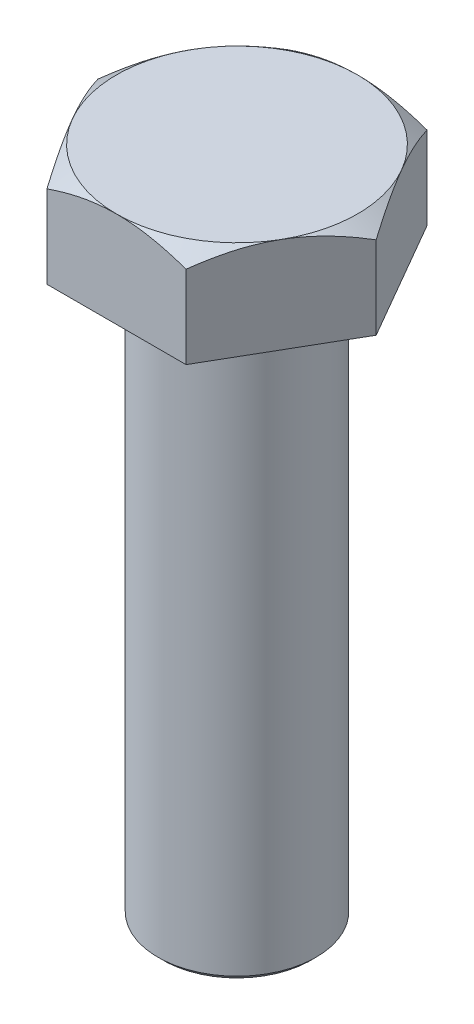
ISO-10303-21;
HEADER;
FILE_DESCRIPTION(('STEP AP214'),'2;1');
FILE_NAME('part.step','',(''),(''),'','','');
FILE_SCHEMA(('AUTOMOTIVE_DESIGN { 1 0 10303 214 1 1 1 1 }'));
ENDSEC;
DATA;
#1=APPLICATION_CONTEXT('core data for automotive mechanical design processes');
#2=APPLICATION_PROTOCOL_DEFINITION('international standard','automotive_design',2000,#1);
#3=PRODUCT_CONTEXT('',#1,'mechanical');
#4=PRODUCT('Part','Part','',(#3));
#5=PRODUCT_RELATED_PRODUCT_CATEGORY('part','',(#4));
#6=PRODUCT_DEFINITION_FORMATION('','',#4);
#7=PRODUCT_DEFINITION_CONTEXT('part definition',#1,'design');
#8=PRODUCT_DEFINITION('design','',#6,#7);
#9=PRODUCT_DEFINITION_SHAPE('','',#8);
#10=(LENGTH_UNIT() NAMED_UNIT(*) SI_UNIT(.MILLI.,.METRE.));
#11=(NAMED_UNIT(*) PLANE_ANGLE_UNIT() SI_UNIT($,.RADIAN.));
#12=(NAMED_UNIT(*) SI_UNIT($,.STERADIAN.) SOLID_ANGLE_UNIT());
#13=UNCERTAINTY_MEASURE_WITH_UNIT(LENGTH_MEASURE(1.E-05),#10,'distance_accuracy_value','');
#14=(GEOMETRIC_REPRESENTATION_CONTEXT(3) GLOBAL_UNCERTAINTY_ASSIGNED_CONTEXT((#13)) GLOBAL_UNIT_ASSIGNED_CONTEXT((#10,
#11,#12)) REPRESENTATION_CONTEXT('',''));
#15=CARTESIAN_POINT('',(0.,0.,0.));
#16=DIRECTION('',(0.,0.,1.));
#17=DIRECTION('',(1.,0.,0.));
#18=AXIS2_PLACEMENT_3D('',#15,#16,#17);
#19=CARTESIAN_POINT('',(4.,5.5,6.92820323027551));
#20=DIRECTION('',(-0.866025403784439,0.,-0.5));
#21=DIRECTION('',(-0.5,0.,0.866025403784439));
#22=AXIS2_PLACEMENT_3D('',#19,#20,#21);
#23=PLANE('',#22);
#24=CARTESIAN_POINT('',(3.99988452994616,4.74943896765747,6.92840323027551));
#25=CARTESIAN_POINT('',(4.08954550310467,4.81220498461447,6.7731058693089));
#26=CARTESIAN_POINT('',(4.17968857312593,4.87217525455348,6.61697349208183));
#27=CARTESIAN_POINT('',(4.36105452071659,4.98564893794491,6.30283845609194));
#28=CARTESIAN_POINT('',(4.45227812398797,5.03914769884547,6.1448345403764));
#29=CARTESIAN_POINT('',(4.72816502901582,5.18882579264657,5.66698440372524));
#30=CARTESIAN_POINT('',(4.91444376943299,5.2737534592842,5.34434016095278));
#31=CARTESIAN_POINT('',(5.19288716018981,5.37158202582702,4.86206206113021));
#32=CARTESIAN_POINT('',(5.28380994973109,5.3990030607716,4.70457917007881));
#33=CARTESIAN_POINT('',(5.46625968942932,5.44436285797016,4.38856695109375));
#34=CARTESIAN_POINT('',(5.55778665692153,5.46230134694021,4.23003759313455));
#35=CARTESIAN_POINT('',(5.74101449614723,5.48813302623218,3.91267766623457));
#36=CARTESIAN_POINT('',(5.8327146722445,5.49604589579937,3.75384830217109));
#37=CARTESIAN_POINT('',(6.01619048845463,5.50164707128971,3.43605886653498));
#38=CARTESIAN_POINT('',(6.1079661240088,5.49933595514296,3.27709880285824));
#39=CARTESIAN_POINT('',(6.27525150612491,5.4858589909405,2.98735202166956));
#40=CARTESIAN_POINT('',(6.35079508185347,5.47631476116981,2.85650671032226));
#41=CARTESIAN_POINT('',(6.50159850576026,5.45052884562698,2.59530751816035));
#42=CARTESIAN_POINT('',(6.57685832691996,5.43428653755758,2.46495368414321));
#43=CARTESIAN_POINT('',(6.80220214639427,5.37590937944216,2.07464673964208));
#44=CARTESIAN_POINT('',(6.95168146667567,5.32413906421599,1.81574096223383));
#45=CARTESIAN_POINT('',(7.25287987412732,5.1965133714816,1.29405001736874));
#46=CARTESIAN_POINT('',(7.40452149309689,5.11995155482572,1.03139902877144));
#47=CARTESIAN_POINT('',(7.70462097835995,4.94784743279077,0.511611472970553));
#48=CARTESIAN_POINT('',(7.85308698393403,4.85236235498145,0.25446080811945));
#49=CARTESIAN_POINT('',(8.00011547005384,4.74943896765747,-0.000199999999998757));
#50=B_SPLINE_CURVE_WITH_KNOTS('',3,(#24,#25,#26,#27,#28,#29,#30,#31,#32,#33,#34,#35,#36,#37,#38,
#39,#40,#41,#42,#43,#44,#45,#46,#47,#48,#49),.UNSPECIFIED.,.F.,.F.,(4,2,2,2,2,2,2,2,2,2,2,2,4),
(0.,0.569900114705035,1.1402075419756,2.28464479132333,2.83614894229841,3.38766898658008,
3.93810476881812,4.48850943703131,4.94252139632035,5.39657554593035,6.30569554314999,
7.24341478830124,8.17834031450999),.UNSPECIFIED.);
#51=CARTESIAN_POINT('',(4.00000000000003,4.74951982241011,6.92820323027551));
#52=VERTEX_POINT('',#51);
#53=CARTESIAN_POINT('',(6.,5.5,3.46410161513776));
#54=VERTEX_POINT('',#53);
#55=EDGE_CURVE('E107',#52,#54,#50,.T.);
#56=ORIENTED_EDGE('',*,*,#55,.F.);
#57=DIRECTION('',(0.,-1.,0.));
#58=VECTOR('',#57,1.);
#59=CARTESIAN_POINT('',(4.,5.5,6.92820323027551));
#60=LINE('',#59,#58);
#61=CARTESIAN_POINT('',(4.,0.,6.92820323027551));
#62=VERTEX_POINT('',#61);
#63=EDGE_CURVE('E276',#52,#62,#60,.T.);
#64=ORIENTED_EDGE('',*,*,#63,.T.);
#65=DIRECTION('',(0.5,0.,-0.866025403784438));
#66=VECTOR('',#65,1.);
#67=CARTESIAN_POINT('',(4.,0.,6.92820323027551));
#68=LINE('',#67,#66);
#69=CARTESIAN_POINT('',(8.,0.,0.));
#70=VERTEX_POINT('',#69);
#71=EDGE_CURVE('E116',#62,#70,#68,.T.);
#72=ORIENTED_EDGE('',*,*,#71,.T.);
#73=DIRECTION('',(0.,-1.,0.));
#74=VECTOR('',#73,1.);
#75=CARTESIAN_POINT('',(8.,5.5,0.));
#76=LINE('',#75,#74);
#77=CARTESIAN_POINT('',(8.,4.7495198224101,0.));
#78=VERTEX_POINT('',#77);
#79=EDGE_CURVE('E134',#78,#70,#76,.T.);
#80=ORIENTED_EDGE('',*,*,#79,.F.);
#81=EDGE_CURVE('E117',#54,#78,#50,.T.);
#82=ORIENTED_EDGE('',*,*,#81,.F.);
#83=EDGE_LOOP('',(#56,#64,#72,#80,#82));
#84=FACE_BOUND('',#83,.T.);
#85=ADVANCED_FACE('F32',(#84),#23,.F.);
#86=CARTESIAN_POINT('',(8.,5.5,0.));
#87=DIRECTION('',(-0.866025403784439,0.,0.5));
#88=DIRECTION('',(0.5,0.,0.866025403784439));
#89=AXIS2_PLACEMENT_3D('',#86,#87,#88);
#90=PLANE('',#89);
#91=CARTESIAN_POINT('',(8.00011547005384,4.74943896765747,0.000200000000000144));
#92=CARTESIAN_POINT('',(7.91045449689533,4.81220498461447,-0.155097360966609));
#93=CARTESIAN_POINT('',(7.82031142687406,4.87217525455348,-0.311229738193679));
#94=CARTESIAN_POINT('',(7.63894547928341,4.98564893794491,-0.62536477418357));
#95=CARTESIAN_POINT('',(7.54772187601202,5.03914769884547,-0.783368689899112));
#96=CARTESIAN_POINT('',(7.27183497098418,5.18882579264657,-1.26121882655027));
#97=CARTESIAN_POINT('',(7.08555623056701,5.2737534592842,-1.58386306932274));
#98=CARTESIAN_POINT('',(6.80711283981019,5.37158202582702,-2.06614116914531));
#99=CARTESIAN_POINT('',(6.7161900502689,5.3990030607716,-2.22362406019671));
#100=CARTESIAN_POINT('',(6.53374031057067,5.44436285797016,-2.53963627918176));
#101=CARTESIAN_POINT('',(6.44221334307847,5.46230134694021,-2.69816563714096));
#102=CARTESIAN_POINT('',(6.25898550385277,5.48813302623218,-3.01552556404094));
#103=CARTESIAN_POINT('',(6.1672853277555,5.49604589579937,-3.17435492810442));
#104=CARTESIAN_POINT('',(5.98380951154537,5.50164707128971,-3.49214436374054));
#105=CARTESIAN_POINT('',(5.8920338759912,5.49933595514295,-3.65110442741728));
#106=CARTESIAN_POINT('',(5.72474849387509,5.4858589909405,-3.94085120860595));
#107=CARTESIAN_POINT('',(5.64920491814653,5.47631476116981,-4.07169651995325));
#108=CARTESIAN_POINT('',(5.49840149423974,5.45052884562698,-4.33289571211516));
#109=CARTESIAN_POINT('',(5.42314167308004,5.43428653755758,-4.4632495461323));
#110=CARTESIAN_POINT('',(5.19779785360573,5.37590937944216,-4.85355649063343));
#111=CARTESIAN_POINT('',(5.04831853332433,5.32413906421599,-5.11246226804168));
#112=CARTESIAN_POINT('',(4.74712012587268,5.1965133714816,-5.63415321290677));
#113=CARTESIAN_POINT('',(4.59547850690311,5.11995155482572,-5.89680420150408));
#114=CARTESIAN_POINT('',(4.29537902164005,4.94784743279077,-6.41659175730496));
#115=CARTESIAN_POINT('',(4.14691301606598,4.85236235498145,-6.67374242215606));
#116=CARTESIAN_POINT('',(3.99988452994617,4.74943896765747,-6.92840323027551));
#117=B_SPLINE_CURVE_WITH_KNOTS('',3,(#91,#92,#93,#94,#95,#96,#97,#98,#99,#100,#101,#102,#103,
#104,#105,#106,#107,#108,#109,#110,#111,#112,#113,#114,#115,#116),.UNSPECIFIED.,.F.,.F.,(4,2,2,
2,2,2,2,2,2,2,2,2,4),(0.,0.569900114705036,1.1402075419756,2.28464479132333,2.83614894229842,
3.38766898658008,3.93810476881812,4.48850943703131,4.94252139632035,5.39657554593035,
6.30569554314999,7.24341478830124,8.17834031450998),.UNSPECIFIED.);
#118=CARTESIAN_POINT('',(6.,5.5,-3.46410161513775));
#119=VERTEX_POINT('',#118);
#120=EDGE_CURVE('E124',#78,#119,#117,.T.);
#121=ORIENTED_EDGE('',*,*,#120,.F.);
#122=ORIENTED_EDGE('',*,*,#79,.T.);
#123=DIRECTION('',(-0.5,0.,-0.866025403784439));
#124=VECTOR('',#123,1.);
#125=CARTESIAN_POINT('',(8.,0.,0.));
#126=LINE('',#125,#124);
#127=CARTESIAN_POINT('',(4.,0.,-6.92820323027551));
#128=VERTEX_POINT('',#127);
#129=EDGE_CURVE('E284',#70,#128,#126,.T.);
#130=ORIENTED_EDGE('',*,*,#129,.T.);
#131=DIRECTION('',(0.,-1.,0.));
#132=VECTOR('',#131,1.);
#133=CARTESIAN_POINT('',(4.,5.5,-6.92820323027551));
#134=LINE('',#133,#132);
#135=CARTESIAN_POINT('',(4.00000000000003,4.74951982241011,-6.92820323027551));
#136=VERTEX_POINT('',#135);
#137=EDGE_CURVE('E200',#136,#128,#134,.T.);
#138=ORIENTED_EDGE('',*,*,#137,.F.);
#139=EDGE_CURVE('E135',#119,#136,#117,.T.);
#140=ORIENTED_EDGE('',*,*,#139,.F.);
#141=EDGE_LOOP('',(#121,#122,#130,#138,#140));
#142=FACE_BOUND('',#141,.T.);
#143=ADVANCED_FACE('F189',(#142),#90,.F.);
#144=CARTESIAN_POINT('',(4.,5.5,-6.92820323027551));
#145=DIRECTION('',(0.,0.,1.));
#146=DIRECTION('',(1.,0.,0.));
#147=AXIS2_PLACEMENT_3D('',#144,#145,#146);
#148=PLANE('',#147);
#149=CARTESIAN_POINT('',(-10.4525779445486,1.57044398855037,-6.92820323027552));
#150=CARTESIAN_POINT('',(-10.1727420491522,1.7337265909833,-6.92820323027552));
#151=CARTESIAN_POINT('',(-9.8920591787089,1.89558087675142,-6.92820323027552));
#152=CARTESIAN_POINT('',(-9.32857003283792,2.21566374281461,-6.92820323027552));
#153=CARTESIAN_POINT('',(-9.04576338980001,2.37389167526808,-6.92820323027552));
#154=CARTESIAN_POINT('',(-8.47591032980708,2.68687516293579,-6.92820323027552));
#155=CARTESIAN_POINT('',(-8.18884843536985,2.84160263039554,-6.92820323027551));
#156=CARTESIAN_POINT('',(-7.61176324752836,3.14541134495982,-6.92820323027551));
#157=CARTESIAN_POINT('',(-7.3217401160319,3.29449289868216,-6.92820323027551));
#158=CARTESIAN_POINT('',(-6.7238722120458,3.59266221882408,-6.92820323027551));
#159=CARTESIAN_POINT('',(-6.41584910048593,3.74139431143611,-6.92820323027551));
#160=CARTESIAN_POINT('',(-5.79505751417746,4.02878971377175,-6.92820323027551));
#161=CARTESIAN_POINT('',(-5.48228837728025,4.16745160262791,-6.92820323027551));
#162=CARTESIAN_POINT('',(-4.85191889718275,4.4313228018108,-6.92820323027551));
#163=CARTESIAN_POINT('',(-4.53433141187263,4.55656250652884,-6.92820323027551));
#164=CARTESIAN_POINT('',(-3.89299699623394,4.78991090297214,-6.92820323027551));
#165=CARTESIAN_POINT('',(-3.56925246793362,4.89802612785701,-6.92820323027551));
#166=CARTESIAN_POINT('',(-2.90649845454706,5.09469927424821,-6.92820323027551));
#167=CARTESIAN_POINT('',(-2.5673109944252,5.18267462476449,-6.92820323027551));
#168=CARTESIAN_POINT('',(-2.05385363012842,5.2926117207029,-6.92820323027551));
#169=CARTESIAN_POINT('',(-1.88191616025975,5.32558714336326,-6.92820323027551));
#170=CARTESIAN_POINT('',(-1.53670053029529,5.38348579783585,-6.92820323027551));
#171=CARTESIAN_POINT('',(-1.36342257865505,5.40841025684993,-6.92820323027551));
#172=CARTESIAN_POINT('',(-1.01891374396543,5.44923328536604,-6.92820323027551));
#173=CARTESIAN_POINT('',(-0.847700970746773,5.4652839174267,-6.92820323027551));
#174=CARTESIAN_POINT('',(-0.504675421463202,5.48861503693063,-6.92820323027551));
#175=CARTESIAN_POINT('',(-0.332862650439726,5.49589559788679,-6.92820323027551));
#176=CARTESIAN_POINT('',(0.0109202462098,5.50148595419464,-6.92820323027551));
#177=CARTESIAN_POINT('',(0.182890378774521,5.4997953328225,-6.92820323027551));
#178=CARTESIAN_POINT('',(0.526497134224974,5.48749807882741,-6.92820323027551));
#179=CARTESIAN_POINT('',(0.698133761490591,5.47689156409997,-6.92820323027551));
#180=CARTESIAN_POINT('',(1.17620570972727,5.43519325655164,-6.92820323027551));
#181=CARTESIAN_POINT('',(1.48184055618104,5.39453291629195,-6.92820323027551));
#182=CARTESIAN_POINT('',(2.08868745872282,5.28852857723728,-6.92820323027551));
#183=CARTESIAN_POINT('',(2.38989938724807,5.22318386795963,-6.92820323027551));
#184=CARTESIAN_POINT('',(2.84080724258361,5.1089687615932,-6.92820323027551));
#185=CARTESIAN_POINT('',(2.99248768099902,5.06769446737555,-6.92820323027551));
#186=CARTESIAN_POINT('',(3.29446083397248,4.98032938627651,-6.92820323027551));
#187=CARTESIAN_POINT('',(3.44475353349638,4.93423854728134,-6.92820323027551));
#188=CARTESIAN_POINT('',(3.74392742146412,4.83776913742411,-6.92820323027551));
#189=CARTESIAN_POINT('',(3.89280879530177,4.78739113865329,-6.92820323027551));
#190=CARTESIAN_POINT('',(4.18921128479501,4.68282284753594,-6.92820323027551));
#191=CARTESIAN_POINT('',(4.33673247941168,4.62863277808383,-6.92820323027551));
#192=CARTESIAN_POINT('',(4.83276416059709,4.43993953265688,-6.92820323027551));
#193=CARTESIAN_POINT('',(5.17830440517849,4.29760103072028,-6.92820323027551));
#194=CARTESIAN_POINT('',(5.86322305627943,3.99872304213689,-6.92820323027551));
#195=CARTESIAN_POINT('',(6.20259939230568,3.84217888586371,-6.92820323027551));
#196=CARTESIAN_POINT('',(6.87658490431575,3.51824051547478,-6.92820323027551));
#197=CARTESIAN_POINT('',(7.21118818422919,3.3508340970132,-6.92820323027551));
#198=CARTESIAN_POINT('',(7.87613803996089,3.00790825953813,-6.92820323027551));
#199=CARTESIAN_POINT('',(8.20648510461357,2.83238978302543,-6.92820323027551));
#200=CARTESIAN_POINT('',(8.86534506878731,2.47420135708274,-6.92820323027551));
#201=CARTESIAN_POINT('',(9.19384129785942,2.29150084714481,-6.92820323027551));
#202=CARTESIAN_POINT('',(9.84801773784232,1.92112210189707,-6.92820323027551));
#203=CARTESIAN_POINT('',(10.1736978828836,1.73344375056862,-6.92820323027551));
#204=CARTESIAN_POINT('',(10.8225380827242,1.35425088878982,-6.92820323027551));
#205=CARTESIAN_POINT('',(11.1456995932939,1.16273886454481,-6.9282032302755));
#206=CARTESIAN_POINT('',(11.7901047387146,0.776526972972777,-6.9282032302755));
#207=CARTESIAN_POINT('',(12.1113483912547,0.581827135110087,-6.9282032302755));
#208=CARTESIAN_POINT('',(12.9919980855822,0.043199146145693,-6.9282032302755));
#209=CARTESIAN_POINT('',(13.5497736796539,-0.303393706817193,-6.9282032302755));
#210=CARTESIAN_POINT('',(14.6618346889949,-1.0023253213855,-6.9282032302755));
#211=CARTESIAN_POINT('',(15.2161194868585,-1.35466506194093,-6.9282032302755));
#212=CARTESIAN_POINT('',(16.3166704014485,-2.06018820000208,-6.9282032302755));
#213=CARTESIAN_POINT('',(16.8629624625966,-2.41333116630861,-6.9282032302755));
#214=CARTESIAN_POINT('',(17.6807876800791,-2.9453933517163,-6.9282032302755));
#215=CARTESIAN_POINT('',(17.9530984173856,-3.12311968896477,-6.9282032302755));
#216=CARTESIAN_POINT('',(18.4972568856001,-3.47927799612251,-6.9282032302755));
#217=CARTESIAN_POINT('',(18.7691046179535,-3.65770996382319,-6.9282032302755));
#218=CARTESIAN_POINT('',(19.0407492428336,-3.83645071730981,-6.9282032302755));
#219=B_SPLINE_CURVE_WITH_KNOTS('',3,(#149,#150,#151,#152,#153,#154,#155,#156,#157,#158,#159,
#160,#161,#162,#163,#164,#165,#166,#167,#168,#169,#170,#171,#172,#173,#174,#175,#176,#177,#178,
#179,#180,#181,#182,#183,#184,#185,#186,#187,#188,#189,#190,#191,#192,#193,#194,#195,#196,#197,
#198,#199,#200,#201,#202,#203,#204,#205,#206,#207,#208,#209,#210,#211,#212,#213,#214,#215,#216,
#217,#218),.UNSPECIFIED.,.F.,.F.,(4,2,2,2,2,2,2,2,2,2,2,2,2,2,2,2,2,2,2,2,2,2,2,2,2,2,2,2,2,2,2,
2,2,2,4),(0.,0.971982359531412,1.94413702939269,2.92240412389834,3.90061801434786,
4.9266324751616,5.95279142258416,6.97657522919415,7.99996750637984,9.05000842543025,
9.57506294702938,10.1000373971851,10.6157125212983,11.1313833228664,11.6470780782657,
12.1627660147019,13.0865005917033,14.010261758302,14.4817831718111,14.9533096875904,
15.4247733798519,15.8962095281806,17.016843753025,18.1378476920048,19.2601337127412,
20.3822896666838,21.5098890032751,22.6375146439794,23.7644312828482,24.89133751172,
26.8613499567322,28.8317015615619,30.7831739571123,31.758702813943,32.7342286198302),.UNSPECIFIED.);
#220=CARTESIAN_POINT('',(0.,5.5,-6.92820323027551));
#221=VERTEX_POINT('',#220);
#222=EDGE_CURVE('E183',#136,#221,#219,.F.);
#223=ORIENTED_EDGE('',*,*,#222,.F.);
#224=ORIENTED_EDGE('',*,*,#137,.T.);
#225=DIRECTION('',(-1.,0.,0.));
#226=VECTOR('',#225,1.);
#227=CARTESIAN_POINT('',(4.,0.,-6.92820323027551));
#228=LINE('',#227,#226);
#229=CARTESIAN_POINT('',(-4.,0.,-6.92820323027551));
#230=VERTEX_POINT('',#229);
#231=EDGE_CURVE('E218',#128,#230,#228,.T.);
#232=ORIENTED_EDGE('',*,*,#231,.T.);
#233=DIRECTION('',(0.,-1.,0.));
#234=VECTOR('',#233,1.);
#235=CARTESIAN_POINT('',(-4.,5.5,-6.92820323027551));
#236=LINE('',#235,#234);
#237=CARTESIAN_POINT('',(-4.,4.7495198224101,-6.92820323027551));
#238=VERTEX_POINT('',#237);
#239=EDGE_CURVE('E216',#238,#230,#236,.T.);
#240=ORIENTED_EDGE('',*,*,#239,.F.);
#241=EDGE_CURVE('E178',#221,#238,#219,.F.);
#242=ORIENTED_EDGE('',*,*,#241,.F.);
#243=EDGE_LOOP('',(#223,#224,#232,#240,#242));
#244=FACE_BOUND('',#243,.T.);
#245=ADVANCED_FACE('F185',(#244),#148,.F.);
#246=CARTESIAN_POINT('',(-4.,5.5,-6.92820323027551));
#247=DIRECTION('',(0.866025403784439,0.,0.5));
#248=DIRECTION('',(0.5,0.,-0.866025403784439));
#249=AXIS2_PLACEMENT_3D('',#246,#247,#248);
#250=PLANE('',#249);
#251=CARTESIAN_POINT('',(-3.99988452994616,4.74943896765747,-6.92840323027551));
#252=CARTESIAN_POINT('',(-4.08954550310467,4.81220498461447,-6.7731058693089));
#253=CARTESIAN_POINT('',(-4.17968857312594,4.87217525455348,-6.61697349208183));
#254=CARTESIAN_POINT('',(-4.36105452071659,4.98564893794491,-6.30283845609194));
#255=CARTESIAN_POINT('',(-4.45227812398798,5.03914769884547,-6.1448345403764));
#256=CARTESIAN_POINT('',(-4.72816502901582,5.18882579264657,-5.66698440372524));
#257=CARTESIAN_POINT('',(-4.91444376943299,5.2737534592842,-5.34434016095278));
#258=CARTESIAN_POINT('',(-5.19288716018981,5.37158202582702,-4.86206206113021));
#259=CARTESIAN_POINT('',(-5.28380994973109,5.3990030607716,-4.70457917007881));
#260=CARTESIAN_POINT('',(-5.46625968942933,5.44436285797016,-4.38856695109375));
#261=CARTESIAN_POINT('',(-5.55778665692153,5.46230134694021,-4.23003759313455));
#262=CARTESIAN_POINT('',(-5.74101449614723,5.48813302623218,-3.91267766623457));
#263=CARTESIAN_POINT('',(-5.8327146722445,5.49604589579937,-3.75384830217109));
#264=CARTESIAN_POINT('',(-6.01619048845463,5.50164707128971,-3.43605886653498));
#265=CARTESIAN_POINT('',(-6.1079661240088,5.49933595514296,-3.27709880285824));
#266=CARTESIAN_POINT('',(-6.27525150612491,5.4858589909405,-2.98735202166956));
#267=CARTESIAN_POINT('',(-6.35079508185347,5.47631476116981,-2.85650671032226));
#268=CARTESIAN_POINT('',(-6.50159850576026,5.45052884562698,-2.59530751816035));
#269=CARTESIAN_POINT('',(-6.57685832691996,5.43428653755758,-2.46495368414321));
#270=CARTESIAN_POINT('',(-6.80220214639427,5.37590937944216,-2.07464673964208));
#271=CARTESIAN_POINT('',(-6.95168146667567,5.32413906421599,-1.81574096223383));
#272=CARTESIAN_POINT('',(-7.25287987412732,5.1965133714816,-1.29405001736874));
#273=CARTESIAN_POINT('',(-7.40452149309689,5.11995155482572,-1.03139902877144));
#274=CARTESIAN_POINT('',(-7.70462097835995,4.94784743279077,-0.511611472970554));
#275=CARTESIAN_POINT('',(-7.85308698393403,4.85236235498145,-0.254460808119452));
#276=CARTESIAN_POINT('',(-8.00011547005384,4.74943896765747,0.000199999999997483));
#277=B_SPLINE_CURVE_WITH_KNOTS('',3,(#251,#252,#253,#254,#255,#256,#257,#258,#259,#260,#261,
#262,#263,#264,#265,#266,#267,#268,#269,#270,#271,#272,#273,#274,#275,#276),.UNSPECIFIED.,.F.,
.F.,(4,2,2,2,2,2,2,2,2,2,2,2,4),(0.,0.569900114705035,1.1402075419756,2.28464479132333,
2.83614894229841,3.38766898658008,3.93810476881812,4.48850943703131,4.94252139632035,
5.39657554593035,6.30569554314999,7.24341478830124,8.17834031450998),.UNSPECIFIED.);
#278=CARTESIAN_POINT('',(-6.,5.5,-3.46410161513776));
#279=VERTEX_POINT('',#278);
#280=EDGE_CURVE('E184',#238,#279,#277,.T.);
#281=ORIENTED_EDGE('',*,*,#280,.F.);
#282=ORIENTED_EDGE('',*,*,#239,.T.);
#283=DIRECTION('',(-0.5,0.,0.866025403784439));
#284=VECTOR('',#283,1.);
#285=CARTESIAN_POINT('',(-4.,0.,-6.92820323027551));
#286=LINE('',#285,#284);
#287=CARTESIAN_POINT('',(-8.,0.,0.));
#288=VERTEX_POINT('',#287);
#289=EDGE_CURVE('E282',#230,#288,#286,.T.);
#290=ORIENTED_EDGE('',*,*,#289,.T.);
#291=DIRECTION('',(0.,-1.,0.));
#292=VECTOR('',#291,1.);
#293=CARTESIAN_POINT('',(-8.,5.5,0.));
#294=LINE('',#293,#292);
#295=CARTESIAN_POINT('',(-8.,4.7495198224101,0.));
#296=VERTEX_POINT('',#295);
#297=EDGE_CURVE('E222',#296,#288,#294,.T.);
#298=ORIENTED_EDGE('',*,*,#297,.F.);
#299=EDGE_CURVE('E173',#279,#296,#277,.T.);
#300=ORIENTED_EDGE('',*,*,#299,.F.);
#301=EDGE_LOOP('',(#281,#282,#290,#298,#300));
#302=FACE_BOUND('',#301,.T.);
#303=ADVANCED_FACE('F188',(#302),#250,.F.);
#304=CARTESIAN_POINT('',(-8.,5.5,0.));
#305=DIRECTION('',(0.866025403784439,0.,-0.5));
#306=DIRECTION('',(-0.5,0.,-0.866025403784439));
#307=AXIS2_PLACEMENT_3D('',#304,#305,#306);
#308=PLANE('',#307);
#309=CARTESIAN_POINT('',(-8.00011547005384,4.74943896765747,-0.000200000000002687));
#310=CARTESIAN_POINT('',(-7.91045449689533,4.81220498461447,0.155097360966606));
#311=CARTESIAN_POINT('',(-7.82031142687406,4.87217525455348,0.311229738193676));
#312=CARTESIAN_POINT('',(-7.63894547928341,4.98564893794491,0.625364774183566));
#313=CARTESIAN_POINT('',(-7.54772187601202,5.03914769884547,0.783368689899109));
#314=CARTESIAN_POINT('',(-7.27183497098418,5.18882579264657,1.26121882655027));
#315=CARTESIAN_POINT('',(-7.08555623056701,5.2737534592842,1.58386306932273));
#316=CARTESIAN_POINT('',(-6.80711283981019,5.37158202582702,2.0661411691453));
#317=CARTESIAN_POINT('',(-6.71619005026891,5.3990030607716,2.2236240601967));
#318=CARTESIAN_POINT('',(-6.53374031057067,5.44436285797016,2.53963627918176));
#319=CARTESIAN_POINT('',(-6.44221334307847,5.46230134694021,2.69816563714096));
#320=CARTESIAN_POINT('',(-6.25898550385277,5.48813302623218,3.01552556404094));
#321=CARTESIAN_POINT('',(-6.1672853277555,5.49604589579937,3.17435492810442));
#322=CARTESIAN_POINT('',(-5.98380951154537,5.50164707128971,3.49214436374053));
#323=CARTESIAN_POINT('',(-5.8920338759912,5.49933595514296,3.65110442741728));
#324=CARTESIAN_POINT('',(-5.72474849387509,5.4858589909405,3.94085120860595));
#325=CARTESIAN_POINT('',(-5.64920491814653,5.47631476116981,4.07169651995325));
#326=CARTESIAN_POINT('',(-5.49840149423974,5.45052884562698,4.33289571211516));
#327=CARTESIAN_POINT('',(-5.42314167308004,5.43428653755758,4.4632495461323));
#328=CARTESIAN_POINT('',(-5.19779785360573,5.37590937944216,4.85355649063343));
#329=CARTESIAN_POINT('',(-5.04831853332434,5.32413906421599,5.11246226804168));
#330=CARTESIAN_POINT('',(-4.74712012587268,5.1965133714816,5.63415321290677));
#331=CARTESIAN_POINT('',(-4.59547850690311,5.11995155482572,5.89680420150407));
#332=CARTESIAN_POINT('',(-4.29537902164005,4.94784743279077,6.41659175730496));
#333=CARTESIAN_POINT('',(-4.14691301606598,4.85236235498145,6.67374242215606));
#334=CARTESIAN_POINT('',(-3.99988452994617,4.74943896765747,6.92840323027551));
#335=B_SPLINE_CURVE_WITH_KNOTS('',3,(#309,#310,#311,#312,#313,#314,#315,#316,#317,#318,#319,
#320,#321,#322,#323,#324,#325,#326,#327,#328,#329,#330,#331,#332,#333,#334),.UNSPECIFIED.,.F.,
.F.,(4,2,2,2,2,2,2,2,2,2,2,2,4),(0.,0.569900114705034,1.1402075419756,2.28464479132333,
2.83614894229841,3.38766898658008,3.93810476881812,4.48850943703131,4.94252139632035,
5.39657554593035,6.30569554314999,7.24341478830123,8.17834031450998),.UNSPECIFIED.);
#336=CARTESIAN_POINT('',(-6.,5.5,3.46410161513775));
#337=VERTEX_POINT('',#336);
#338=EDGE_CURVE('E272',#296,#337,#335,.T.);
#339=ORIENTED_EDGE('',*,*,#338,.F.);
#340=ORIENTED_EDGE('',*,*,#297,.T.);
#341=DIRECTION('',(0.5,0.,0.866025403784439));
#342=VECTOR('',#341,1.);
#343=CARTESIAN_POINT('',(-8.,0.,0.));
#344=LINE('',#343,#342);
#345=CARTESIAN_POINT('',(-4.,0.,6.92820323027551));
#346=VERTEX_POINT('',#345);
#347=EDGE_CURVE('E274',#288,#346,#344,.T.);
#348=ORIENTED_EDGE('',*,*,#347,.T.);
#349=DIRECTION('',(0.,-1.,0.));
#350=VECTOR('',#349,1.);
#351=CARTESIAN_POINT('',(-4.,5.5,6.92820323027551));
#352=LINE('',#351,#350);
#353=CARTESIAN_POINT('',(-4.,4.7495198224101,6.92820323027551));
#354=VERTEX_POINT('',#353);
#355=EDGE_CURVE('E55',#354,#346,#352,.T.);
#356=ORIENTED_EDGE('',*,*,#355,.F.);
#357=EDGE_CURVE('E167',#337,#354,#335,.T.);
#358=ORIENTED_EDGE('',*,*,#357,.F.);
#359=EDGE_LOOP('',(#339,#340,#348,#356,#358));
#360=FACE_BOUND('',#359,.T.);
#361=ADVANCED_FACE('F256',(#360),#308,.F.);
#362=CARTESIAN_POINT('',(-4.,5.5,6.92820323027551));
#363=DIRECTION('',(0.,0.,-1.));
#364=DIRECTION('',(-1.,0.,0.));
#365=AXIS2_PLACEMENT_3D('',#362,#363,#364);
#366=PLANE('',#365);
#367=CARTESIAN_POINT('',(-10.4525779445486,1.57044398855037,6.9282032302755));
#368=CARTESIAN_POINT('',(-10.1727420491522,1.73372659098331,6.9282032302755));
#369=CARTESIAN_POINT('',(-9.8920591787089,1.89558087675142,6.9282032302755));
#370=CARTESIAN_POINT('',(-9.32857003283793,2.21566374281462,6.9282032302755));
#371=CARTESIAN_POINT('',(-9.04576338980001,2.37389167526809,6.9282032302755));
#372=CARTESIAN_POINT('',(-8.47591032980708,2.68687516293579,6.9282032302755));
#373=CARTESIAN_POINT('',(-8.18884843536985,2.84160263039554,6.92820323027551));
#374=CARTESIAN_POINT('',(-7.61176324752836,3.14541134495982,6.92820323027551));
#375=CARTESIAN_POINT('',(-7.32174011603191,3.29449289868217,6.92820323027551));
#376=CARTESIAN_POINT('',(-6.72387221204581,3.59266221882408,6.92820323027551));
#377=CARTESIAN_POINT('',(-6.41584910048593,3.74139431143611,6.92820323027551));
#378=CARTESIAN_POINT('',(-5.79505751417747,4.02878971377175,6.92820323027551));
#379=CARTESIAN_POINT('',(-5.48228837728026,4.16745160262791,6.92820323027551));
#380=CARTESIAN_POINT('',(-4.85191889718275,4.4313228018108,6.92820323027551));
#381=CARTESIAN_POINT('',(-4.53433141187264,4.55656250652884,6.92820323027551));
#382=CARTESIAN_POINT('',(-3.89299699623395,4.78991090297214,6.92820323027551));
#383=CARTESIAN_POINT('',(-3.56925246793362,4.89802612785701,6.92820323027551));
#384=CARTESIAN_POINT('',(-2.90649845454706,5.09469927424821,6.92820323027551));
#385=CARTESIAN_POINT('',(-2.56731099442521,5.1826746247645,6.92820323027551));
#386=CARTESIAN_POINT('',(-2.05385363012842,5.2926117207029,6.92820323027551));
#387=CARTESIAN_POINT('',(-1.88191616025976,5.32558714336326,6.92820323027551));
#388=CARTESIAN_POINT('',(-1.5367005302953,5.38348579783585,6.92820323027551));
#389=CARTESIAN_POINT('',(-1.36342257865505,5.40841025684993,6.92820323027551));
#390=CARTESIAN_POINT('',(-1.01891374396544,5.44923328536604,6.92820323027551));
#391=CARTESIAN_POINT('',(-0.847700970746782,5.46528391742669,6.92820323027551));
#392=CARTESIAN_POINT('',(-0.504675421463211,5.48861503693063,6.92820323027551));
#393=CARTESIAN_POINT('',(-0.332862650439735,5.49589559788679,6.92820323027551));
#394=CARTESIAN_POINT('',(0.0109202462097916,5.50148595419464,6.92820323027551));
#395=CARTESIAN_POINT('',(0.182890378774513,5.4997953328225,6.92820323027551));
#396=CARTESIAN_POINT('',(0.526497134224966,5.48749807882741,6.92820323027551));
#397=CARTESIAN_POINT('',(0.698133761490583,5.47689156409997,6.92820323027551));
#398=CARTESIAN_POINT('',(1.17620570972727,5.43519325655164,6.92820323027551));
#399=CARTESIAN_POINT('',(1.48184055618103,5.39453291629195,6.92820323027551));
#400=CARTESIAN_POINT('',(2.08868745872282,5.28852857723728,6.92820323027551));
#401=CARTESIAN_POINT('',(2.38989938724806,5.22318386795963,6.92820323027551));
#402=CARTESIAN_POINT('',(2.8408072425836,5.10896876159321,6.92820323027551));
#403=CARTESIAN_POINT('',(2.99248768099901,5.06769446737555,6.92820323027551));
#404=CARTESIAN_POINT('',(3.29446083397247,4.98032938627651,6.92820323027551));
#405=CARTESIAN_POINT('',(3.44475353349638,4.93423854728134,6.92820323027551));
#406=CARTESIAN_POINT('',(3.74392742146411,4.83776913742411,6.92820323027551));
#407=CARTESIAN_POINT('',(3.89280879530177,4.78739113865329,6.92820323027551));
#408=CARTESIAN_POINT('',(4.18921128479501,4.68282284753594,6.92820323027551));
#409=CARTESIAN_POINT('',(4.33673247941167,4.62863277808383,6.92820323027551));
#410=CARTESIAN_POINT('',(4.83276416059708,4.43993953265688,6.92820323027551));
#411=CARTESIAN_POINT('',(5.17830440517848,4.29760103072028,6.92820323027551));
#412=CARTESIAN_POINT('',(5.86322305627943,3.99872304213688,6.92820323027551));
#413=CARTESIAN_POINT('',(6.20259939230568,3.84217888586371,6.92820323027551));
#414=CARTESIAN_POINT('',(6.87658490431575,3.51824051547478,6.92820323027551));
#415=CARTESIAN_POINT('',(7.21118818422918,3.3508340970132,6.92820323027552));
#416=CARTESIAN_POINT('',(7.87613803996088,3.00790825953813,6.92820323027552));
#417=CARTESIAN_POINT('',(8.20648510461356,2.83238978302543,6.92820323027552));
#418=CARTESIAN_POINT('',(8.8653450687873,2.47420135708273,6.92820323027552));
#419=CARTESIAN_POINT('',(9.19384129785941,2.29150084714481,6.92820323027552));
#420=CARTESIAN_POINT('',(9.84801773784231,1.92112210189707,6.92820323027552));
#421=CARTESIAN_POINT('',(10.1736978828836,1.73344375056861,6.92820323027552));
#422=CARTESIAN_POINT('',(10.8225380827242,1.35425088878982,6.92820323027552));
#423=CARTESIAN_POINT('',(11.1456995932938,1.16273886454481,6.92820323027552));
#424=CARTESIAN_POINT('',(11.7901047387146,0.776526972972775,6.92820323027552));
#425=CARTESIAN_POINT('',(12.1113483912547,0.581827135110086,6.92820323027552));
#426=CARTESIAN_POINT('',(12.9919980855822,0.0431991461456934,6.92820323027552));
#427=CARTESIAN_POINT('',(13.5497736796539,-0.303393706817192,6.92820323027552));
#428=CARTESIAN_POINT('',(14.6618346889949,-1.00232532138549,6.92820323027552));
#429=CARTESIAN_POINT('',(15.2161194868584,-1.35466506194092,6.92820323027552));
#430=CARTESIAN_POINT('',(16.3166704014485,-2.06018820000208,6.92820323027552));
#431=CARTESIAN_POINT('',(16.8629624625966,-2.41333116630861,6.92820323027552));
#432=CARTESIAN_POINT('',(17.6807876800791,-2.9453933517163,6.92820323027552));
#433=CARTESIAN_POINT('',(17.9530984173856,-3.12311968896477,6.92820323027552));
#434=CARTESIAN_POINT('',(18.4972568856001,-3.47927799612251,6.92820323027552));
#435=CARTESIAN_POINT('',(18.7691046179535,-3.65770996382319,6.92820323027552));
#436=CARTESIAN_POINT('',(19.0407492428336,-3.83645071730981,6.92820323027552));
#437=B_SPLINE_CURVE_WITH_KNOTS('',3,(#367,#368,#369,#370,#371,#372,#373,#374,#375,#376,#377,
#378,#379,#380,#381,#382,#383,#384,#385,#386,#387,#388,#389,#390,#391,#392,#393,#394,#395,#396,
#397,#398,#399,#400,#401,#402,#403,#404,#405,#406,#407,#408,#409,#410,#411,#412,#413,#414,#415,
#416,#417,#418,#419,#420,#421,#422,#423,#424,#425,#426,#427,#428,#429,#430,#431,#432,#433,#434,
#435,#436),.UNSPECIFIED.,.F.,.F.,(4,2,2,2,2,2,2,2,2,2,2,2,2,2,2,2,2,2,2,2,2,2,2,2,2,2,2,2,2,2,2,
2,2,2,4),(0.,0.971982359531409,1.94413702939268,2.92240412389834,3.90061801434786,
4.92663247516159,5.95279142258415,6.97657522919414,7.99996750637983,9.05000842543024,
9.57506294702937,10.1000373971851,10.6157125212983,11.1313833228664,11.6470780782657,
12.1627660147019,13.0865005917033,14.010261758302,14.4817831718111,14.9533096875904,
15.4247733798519,15.8962095281806,17.016843753025,18.1378476920048,19.2601337127412,
20.3822896666838,21.5098890032751,22.6375146439794,23.7644312828482,24.89133751172,
26.8613499567322,28.8317015615619,30.7831739571123,31.758702813943,32.7342286198302),.UNSPECIFIED.);
#438=CARTESIAN_POINT('',(0.,5.5,6.92820323027551));
#439=VERTEX_POINT('',#438);
#440=EDGE_CURVE('E269',#354,#439,#437,.T.);
#441=ORIENTED_EDGE('',*,*,#440,.F.);
#442=ORIENTED_EDGE('',*,*,#355,.T.);
#443=DIRECTION('',(1.,0.,0.));
#444=VECTOR('',#443,1.);
#445=CARTESIAN_POINT('',(-4.,0.,6.92820323027551));
#446=LINE('',#445,#444);
#447=EDGE_CURVE('E277',#346,#62,#446,.T.);
#448=ORIENTED_EDGE('',*,*,#447,.T.);
#449=ORIENTED_EDGE('',*,*,#63,.F.);
#450=EDGE_CURVE('E112',#439,#52,#437,.T.);
#451=ORIENTED_EDGE('',*,*,#450,.F.);
#452=EDGE_LOOP('',(#441,#442,#448,#449,#451));
#453=FACE_BOUND('',#452,.T.);
#454=ADVANCED_FACE('F155',(#453),#366,.F.);
#455=CARTESIAN_POINT('',(8.,0.,0.));
#456=DIRECTION('',(0.,-1.,0.));
#457=DIRECTION('',(0.,0.,-1.));
#458=AXIS2_PLACEMENT_3D('',#455,#456,#457);
#459=PLANE('',#458);
#460=ORIENTED_EDGE('',*,*,#71,.F.);
#461=ORIENTED_EDGE('',*,*,#447,.F.);
#462=ORIENTED_EDGE('',*,*,#347,.F.);
#463=ORIENTED_EDGE('',*,*,#289,.F.);
#464=ORIENTED_EDGE('',*,*,#231,.F.);
#465=ORIENTED_EDGE('',*,*,#129,.F.);
#466=EDGE_LOOP('',(#460,#461,#462,#463,#464,#465));
#467=FACE_BOUND('',#466,.T.);
#468=CARTESIAN_POINT('',(0.,0.,0.));
#469=DIRECTION('',(0.,-1.,0.));
#470=DIRECTION('',(0.,0.,-1.));
#471=AXIS2_PLACEMENT_3D('',#468,#469,#470);
#472=CIRCLE('',#471,4.54545454545454);
#473=CARTESIAN_POINT('',(0.,0.,-4.54545454545454));
#474=VERTEX_POINT('',#473);
#475=EDGE_CURVE('E229',#474,#474,#472,.T.);
#476=ORIENTED_EDGE('',*,*,#475,.F.);
#477=EDGE_LOOP('',(#476));
#478=FACE_BOUND('',#477,.T.);
#479=ADVANCED_FACE('F246',(#467,#478),#459,.T.);
#480=CARTESIAN_POINT('',(0.,0.,0.));
#481=DIRECTION('',(0.,-1.,0.));
#482=DIRECTION('',(0.,0.,-1.));
#483=AXIS2_PLACEMENT_3D('',#480,#481,#482);
#484=CYLINDRICAL_SURFACE('',#483,4.54545454545455);
#485=CARTESIAN_POINT('',(0.,-32.7,0.));
#486=DIRECTION('',(0.,-1.,0.));
#487=DIRECTION('',(0.,0.,-1.));
#488=AXIS2_PLACEMENT_3D('',#485,#486,#487);
#489=CIRCLE('',#488,4.54545454545455);
#490=CARTESIAN_POINT('',(0.,-32.7,-4.54545454545455));
#491=VERTEX_POINT('',#490);
#492=EDGE_CURVE('E12',#491,#491,#489,.F.);
#493=ORIENTED_EDGE('',*,*,#492,.T.);
#494=EDGE_LOOP('',(#493));
#495=FACE_BOUND('',#494,.T.);
#496=ORIENTED_EDGE('',*,*,#475,.T.);
#497=EDGE_LOOP('',(#496));
#498=FACE_BOUND('',#497,.T.);
#499=ADVANCED_FACE('F243',(#495,#498),#484,.T.);
#500=CARTESIAN_POINT('',(4.54545454545455,-33.,0.));
#501=DIRECTION('',(0.,-1.,0.));
#502=DIRECTION('',(0.,0.,-1.));
#503=AXIS2_PLACEMENT_3D('',#500,#501,#502);
#504=PLANE('',#503);
#505=CARTESIAN_POINT('',(0.,-33.,0.));
#506=DIRECTION('',(0.,-1.,0.));
#507=DIRECTION('',(0.,0.,-1.));
#508=AXIS2_PLACEMENT_3D('',#505,#506,#507);
#509=CIRCLE('',#508,4.24545454545455);
#510=CARTESIAN_POINT('',(0.,-33.,-4.24545454545455));
#511=VERTEX_POINT('',#510);
#512=EDGE_CURVE('E40',#511,#511,#509,.T.);
#513=ORIENTED_EDGE('',*,*,#512,.T.);
#514=EDGE_LOOP('',(#513));
#515=FACE_BOUND('',#514,.T.);
#516=ADVANCED_FACE('F234',(#515),#504,.T.);
#517=CARTESIAN_POINT('',(0.,5.5,0.));
#518=DIRECTION('',(0.,-1.,0.));
#519=DIRECTION('',(0.,0.,1.));
#520=AXIS2_PLACEMENT_3D('',#517,#518,#519);
#521=CONICAL_SURFACE('',#520,6.92820323027551,0.959931088596883);
#522=ORIENTED_EDGE('',*,*,#357,.T.);
#523=ORIENTED_EDGE('',*,*,#440,.T.);
#524=CARTESIAN_POINT('',(0.,5.5,0.));
#525=DIRECTION('',(0.,1.,0.));
#526=DIRECTION('',(0.,0.,1.));
#527=AXIS2_PLACEMENT_3D('',#524,#525,#526);
#528=CIRCLE('',#527,6.92820323027551);
#529=EDGE_CURVE('E47',#337,#439,#528,.T.);
#530=ORIENTED_EDGE('',*,*,#529,.F.);
#531=EDGE_LOOP('',(#522,#523,#530));
#532=FACE_BOUND('',#531,.T.);
#533=ADVANCED_FACE('F154',(#532),#521,.T.);
#534=ORIENTED_EDGE('',*,*,#299,.T.);
#535=ORIENTED_EDGE('',*,*,#338,.T.);
#536=EDGE_CURVE('E213',#279,#337,#528,.T.);
#537=ORIENTED_EDGE('',*,*,#536,.F.);
#538=EDGE_LOOP('',(#534,#535,#537));
#539=FACE_BOUND('',#538,.T.);
#540=ADVANCED_FACE('F262',(#539),#521,.T.);
#541=ORIENTED_EDGE('',*,*,#241,.T.);
#542=ORIENTED_EDGE('',*,*,#280,.T.);
#543=EDGE_CURVE('E208',#221,#279,#528,.T.);
#544=ORIENTED_EDGE('',*,*,#543,.F.);
#545=EDGE_LOOP('',(#541,#542,#544));
#546=FACE_BOUND('',#545,.T.);
#547=ADVANCED_FACE('F209',(#546),#521,.T.);
#548=ORIENTED_EDGE('',*,*,#139,.T.);
#549=ORIENTED_EDGE('',*,*,#222,.T.);
#550=EDGE_CURVE('E128',#119,#221,#528,.T.);
#551=ORIENTED_EDGE('',*,*,#550,.F.);
#552=EDGE_LOOP('',(#548,#549,#551));
#553=FACE_BOUND('',#552,.T.);
#554=ADVANCED_FACE('F204',(#553),#521,.T.);
#555=ORIENTED_EDGE('',*,*,#81,.T.);
#556=ORIENTED_EDGE('',*,*,#120,.T.);
#557=EDGE_CURVE('E121',#54,#119,#528,.T.);
#558=ORIENTED_EDGE('',*,*,#557,.F.);
#559=EDGE_LOOP('',(#555,#556,#558));
#560=FACE_BOUND('',#559,.T.);
#561=ADVANCED_FACE('F122',(#560),#521,.T.);
#562=ORIENTED_EDGE('',*,*,#55,.T.);
#563=CARTESIAN_POINT('',(0.,5.5,0.));
#564=DIRECTION('',(0.,1.,0.));
#565=DIRECTION('',(0.,0.,1.));
#566=AXIS2_PLACEMENT_3D('',#563,#564,#565);
#567=CIRCLE('',#566,6.92820323027551);
#568=EDGE_CURVE('E110',#439,#54,#567,.T.);
#569=ORIENTED_EDGE('',*,*,#568,.F.);
#570=ORIENTED_EDGE('',*,*,#450,.T.);
#571=EDGE_LOOP('',(#562,#569,#570));
#572=FACE_BOUND('',#571,.T.);
#573=ADVANCED_FACE('F109',(#572),#521,.T.);
#574=CARTESIAN_POINT('',(0.,5.5,0.));
#575=DIRECTION('',(0.,1.,0.));
#576=DIRECTION('',(0.,0.,1.));
#577=AXIS2_PLACEMENT_3D('',#574,#575,#576);
#578=PLANE('',#577);
#579=ORIENTED_EDGE('',*,*,#529,.T.);
#580=ORIENTED_EDGE('',*,*,#568,.T.);
#581=ORIENTED_EDGE('',*,*,#557,.T.);
#582=ORIENTED_EDGE('',*,*,#550,.T.);
#583=ORIENTED_EDGE('',*,*,#543,.T.);
#584=ORIENTED_EDGE('',*,*,#536,.T.);
#585=EDGE_LOOP('',(#579,#580,#581,#582,#583,#584));
#586=FACE_BOUND('',#585,.T.);
#587=ADVANCED_FACE('F130',(#586),#578,.T.);
#588=CARTESIAN_POINT('',(0.,-33.,0.));
#589=DIRECTION('',(0.,1.,0.));
#590=DIRECTION('',(0.,0.,1.));
#591=AXIS2_PLACEMENT_3D('',#588,#589,#590);
#592=CONICAL_SURFACE('',#591,4.24545454545455,0.78539816339746);
#593=ORIENTED_EDGE('',*,*,#492,.F.);
#594=EDGE_LOOP('',(#593));
#595=FACE_BOUND('',#594,.T.);
#596=ORIENTED_EDGE('',*,*,#512,.F.);
#597=EDGE_LOOP('',(#596));
#598=FACE_BOUND('',#597,.T.);
#599=ADVANCED_FACE('F34',(#595,#598),#592,.T.);
#600=CLOSED_SHELL('',(#85,#143,#245,#303,#361,#454,#479,#499,#516,#533,#540,#547,#554,#561,#573,
#587,#599));
#601=MANIFOLD_SOLID_BREP('B2',#600);
#602=ADVANCED_BREP_SHAPE_REPRESENTATION('',(#18,#601),#14);
#603=SHAPE_DEFINITION_REPRESENTATION(#9,#602);
ENDSEC;
END-ISO-10303-21;
